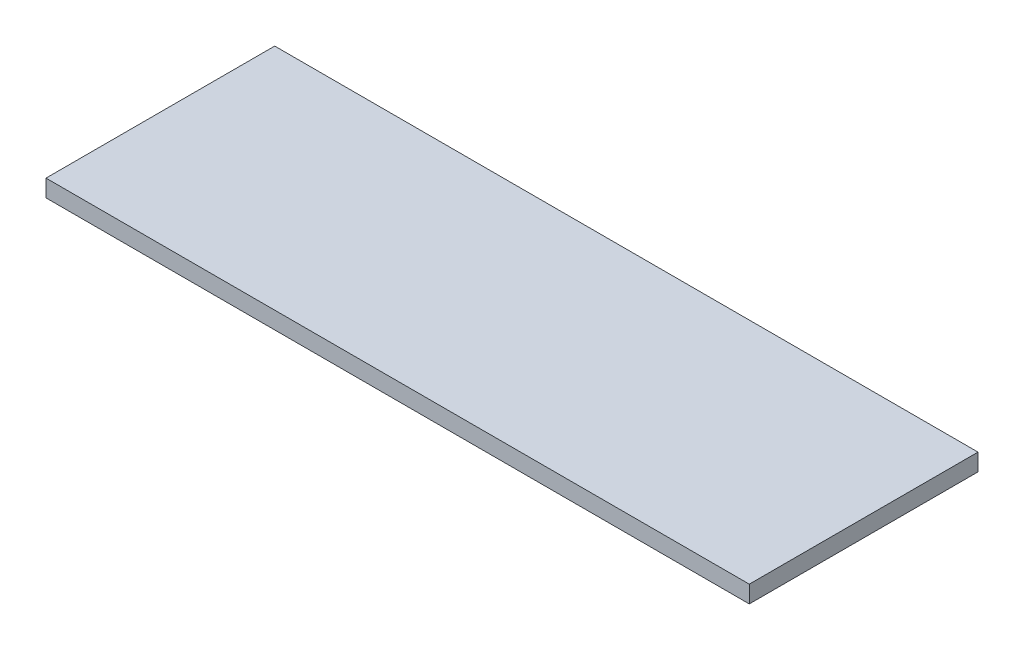
ISO-10303-21;
HEADER;
FILE_DESCRIPTION(('STEP AP214'),'2;1');
FILE_NAME('part.step','',(''),(''),'','','');
FILE_SCHEMA(('AUTOMOTIVE_DESIGN { 1 0 10303 214 1 1 1 1 }'));
ENDSEC;
DATA;
#1=APPLICATION_CONTEXT('core data for automotive mechanical design processes');
#2=APPLICATION_PROTOCOL_DEFINITION('international standard','automotive_design',2000,#1);
#3=PRODUCT_CONTEXT('',#1,'mechanical');
#4=PRODUCT('Part','Part','',(#3));
#5=PRODUCT_RELATED_PRODUCT_CATEGORY('part','',(#4));
#6=PRODUCT_DEFINITION_FORMATION('','',#4);
#7=PRODUCT_DEFINITION_CONTEXT('part definition',#1,'design');
#8=PRODUCT_DEFINITION('design','',#6,#7);
#9=PRODUCT_DEFINITION_SHAPE('','',#8);
#10=(LENGTH_UNIT() NAMED_UNIT(*) SI_UNIT(.MILLI.,.METRE.));
#11=(NAMED_UNIT(*) PLANE_ANGLE_UNIT() SI_UNIT($,.RADIAN.));
#12=(NAMED_UNIT(*) SI_UNIT($,.STERADIAN.) SOLID_ANGLE_UNIT());
#13=UNCERTAINTY_MEASURE_WITH_UNIT(LENGTH_MEASURE(1.E-05),#10,'distance_accuracy_value','');
#14=(GEOMETRIC_REPRESENTATION_CONTEXT(3) GLOBAL_UNCERTAINTY_ASSIGNED_CONTEXT((#13)) GLOBAL_UNIT_ASSIGNED_CONTEXT((#10,
#11,#12)) REPRESENTATION_CONTEXT('',''));
#15=CARTESIAN_POINT('',(0.,0.,0.));
#16=DIRECTION('',(0.,0.,1.));
#17=DIRECTION('',(1.,0.,0.));
#18=AXIS2_PLACEMENT_3D('',#15,#16,#17);
#19=CARTESIAN_POINT('',(307.5,15.,100.));
#20=DIRECTION('',(-1.,0.,0.));
#21=DIRECTION('',(0.,0.,1.));
#22=AXIS2_PLACEMENT_3D('',#19,#20,#21);
#23=PLANE('',#22);
#24=DIRECTION('',(0.,0.,-1.));
#25=VECTOR('',#24,1.);
#26=CARTESIAN_POINT('',(307.5,0.,100.));
#27=LINE('',#26,#25);
#28=CARTESIAN_POINT('',(307.5,0.,100.));
#29=VERTEX_POINT('',#28);
#30=CARTESIAN_POINT('',(307.5,0.,-100.));
#31=VERTEX_POINT('',#30);
#32=EDGE_CURVE('E96',#29,#31,#27,.T.);
#33=ORIENTED_EDGE('',*,*,#32,.T.);
#34=DIRECTION('',(0.,-1.,0.));
#35=VECTOR('',#34,1.);
#36=CARTESIAN_POINT('',(307.5,15.,-100.));
#37=LINE('',#36,#35);
#38=CARTESIAN_POINT('',(307.5,15.,-100.));
#39=VERTEX_POINT('',#38);
#40=EDGE_CURVE('E11',#39,#31,#37,.T.);
#41=ORIENTED_EDGE('',*,*,#40,.F.);
#42=DIRECTION('',(0.,0.,-1.));
#43=VECTOR('',#42,1.);
#44=CARTESIAN_POINT('',(307.5,15.,100.));
#45=LINE('',#44,#43);
#46=CARTESIAN_POINT('',(307.5,15.,100.));
#47=VERTEX_POINT('',#46);
#48=EDGE_CURVE('E84',#47,#39,#45,.T.);
#49=ORIENTED_EDGE('',*,*,#48,.F.);
#50=DIRECTION('',(0.,-1.,0.));
#51=VECTOR('',#50,1.);
#52=CARTESIAN_POINT('',(307.5,15.,100.));
#53=LINE('',#52,#51);
#54=EDGE_CURVE('E92',#47,#29,#53,.T.);
#55=ORIENTED_EDGE('',*,*,#54,.T.);
#56=EDGE_LOOP('',(#33,#41,#49,#55));
#57=FACE_BOUND('',#56,.T.);
#58=ADVANCED_FACE('F33',(#57),#23,.F.);
#59=CARTESIAN_POINT('',(-307.5,15.,-100.));
#60=DIRECTION('',(0.,0.,1.));
#61=DIRECTION('',(1.,0.,0.));
#62=AXIS2_PLACEMENT_3D('',#59,#60,#61);
#63=PLANE('',#62);
#64=DIRECTION('',(-1.,0.,0.));
#65=VECTOR('',#64,1.);
#66=CARTESIAN_POINT('',(-307.5,0.,-100.));
#67=LINE('',#66,#65);
#68=CARTESIAN_POINT('',(-307.5,0.,-100.));
#69=VERTEX_POINT('',#68);
#70=EDGE_CURVE('E88',#31,#69,#67,.T.);
#71=ORIENTED_EDGE('',*,*,#70,.T.);
#72=DIRECTION('',(0.,-1.,0.));
#73=VECTOR('',#72,1.);
#74=CARTESIAN_POINT('',(-307.5,15.,-100.));
#75=LINE('',#74,#73);
#76=CARTESIAN_POINT('',(-307.5,15.,-100.));
#77=VERTEX_POINT('',#76);
#78=EDGE_CURVE('E41',#77,#69,#75,.T.);
#79=ORIENTED_EDGE('',*,*,#78,.F.);
#80=DIRECTION('',(-1.,0.,0.));
#81=VECTOR('',#80,1.);
#82=CARTESIAN_POINT('',(-307.5,15.,-100.));
#83=LINE('',#82,#81);
#84=EDGE_CURVE('E79',#39,#77,#83,.T.);
#85=ORIENTED_EDGE('',*,*,#84,.F.);
#86=ORIENTED_EDGE('',*,*,#40,.T.);
#87=EDGE_LOOP('',(#71,#79,#85,#86));
#88=FACE_BOUND('',#87,.T.);
#89=ADVANCED_FACE('F87',(#88),#63,.F.);
#90=CARTESIAN_POINT('',(-307.5,15.,100.));
#91=DIRECTION('',(1.,0.,0.));
#92=DIRECTION('',(0.,0.,-1.));
#93=AXIS2_PLACEMENT_3D('',#90,#91,#92);
#94=PLANE('',#93);
#95=DIRECTION('',(0.,0.,1.));
#96=VECTOR('',#95,1.);
#97=CARTESIAN_POINT('',(-307.5,0.,100.));
#98=LINE('',#97,#96);
#99=CARTESIAN_POINT('',(-307.5,0.,100.));
#100=VERTEX_POINT('',#99);
#101=EDGE_CURVE('E66',#69,#100,#98,.T.);
#102=ORIENTED_EDGE('',*,*,#101,.T.);
#103=DIRECTION('',(0.,-1.,0.));
#104=VECTOR('',#103,1.);
#105=CARTESIAN_POINT('',(-307.5,15.,100.));
#106=LINE('',#105,#104);
#107=CARTESIAN_POINT('',(-307.5,15.,100.));
#108=VERTEX_POINT('',#107);
#109=EDGE_CURVE('E89',#108,#100,#106,.T.);
#110=ORIENTED_EDGE('',*,*,#109,.F.);
#111=DIRECTION('',(0.,0.,1.));
#112=VECTOR('',#111,1.);
#113=CARTESIAN_POINT('',(-307.5,15.,100.));
#114=LINE('',#113,#112);
#115=EDGE_CURVE('E82',#77,#108,#114,.T.);
#116=ORIENTED_EDGE('',*,*,#115,.F.);
#117=ORIENTED_EDGE('',*,*,#78,.T.);
#118=EDGE_LOOP('',(#102,#110,#116,#117));
#119=FACE_BOUND('',#118,.T.);
#120=ADVANCED_FACE('F90',(#119),#94,.F.);
#121=CARTESIAN_POINT('',(-307.5,15.,100.));
#122=DIRECTION('',(0.,0.,-1.));
#123=DIRECTION('',(-1.,0.,0.));
#124=AXIS2_PLACEMENT_3D('',#121,#122,#123);
#125=PLANE('',#124);
#126=DIRECTION('',(1.,0.,0.));
#127=VECTOR('',#126,1.);
#128=CARTESIAN_POINT('',(-307.5,0.,100.));
#129=LINE('',#128,#127);
#130=EDGE_CURVE('E72',#100,#29,#129,.T.);
#131=ORIENTED_EDGE('',*,*,#130,.T.);
#132=ORIENTED_EDGE('',*,*,#54,.F.);
#133=DIRECTION('',(1.,0.,0.));
#134=VECTOR('',#133,1.);
#135=CARTESIAN_POINT('',(-307.5,15.,100.));
#136=LINE('',#135,#134);
#137=EDGE_CURVE('E49',#108,#47,#136,.T.);
#138=ORIENTED_EDGE('',*,*,#137,.F.);
#139=ORIENTED_EDGE('',*,*,#109,.T.);
#140=EDGE_LOOP('',(#131,#132,#138,#139));
#141=FACE_BOUND('',#140,.T.);
#142=ADVANCED_FACE('F103',(#141),#125,.F.);
#143=CARTESIAN_POINT('',(0.,15.,0.));
#144=DIRECTION('',(0.,-1.,0.));
#145=DIRECTION('',(0.,0.,-1.));
#146=AXIS2_PLACEMENT_3D('',#143,#144,#145);
#147=PLANE('',#146);
#148=ORIENTED_EDGE('',*,*,#48,.T.);
#149=ORIENTED_EDGE('',*,*,#84,.T.);
#150=ORIENTED_EDGE('',*,*,#115,.T.);
#151=ORIENTED_EDGE('',*,*,#137,.T.);
#152=EDGE_LOOP('',(#148,#149,#150,#151));
#153=FACE_BOUND('',#152,.T.);
#154=ADVANCED_FACE('F80',(#153),#147,.F.);
#155=CARTESIAN_POINT('',(0.,0.,0.));
#156=DIRECTION('',(0.,-1.,0.));
#157=DIRECTION('',(0.,0.,-1.));
#158=AXIS2_PLACEMENT_3D('',#155,#156,#157);
#159=PLANE('',#158);
#160=ORIENTED_EDGE('',*,*,#32,.F.);
#161=ORIENTED_EDGE('',*,*,#130,.F.);
#162=ORIENTED_EDGE('',*,*,#101,.F.);
#163=ORIENTED_EDGE('',*,*,#70,.F.);
#164=EDGE_LOOP('',(#160,#161,#162,#163));
#165=FACE_BOUND('',#164,.T.);
#166=ADVANCED_FACE('F106',(#165),#159,.T.);
#167=CLOSED_SHELL('',(#58,#89,#120,#142,#154,#166));
#168=MANIFOLD_SOLID_BREP('B2',#167);
#169=ADVANCED_BREP_SHAPE_REPRESENTATION('',(#18,#168),#14);
#170=SHAPE_DEFINITION_REPRESENTATION(#9,#169);
ENDSEC;
END-ISO-10303-21;
